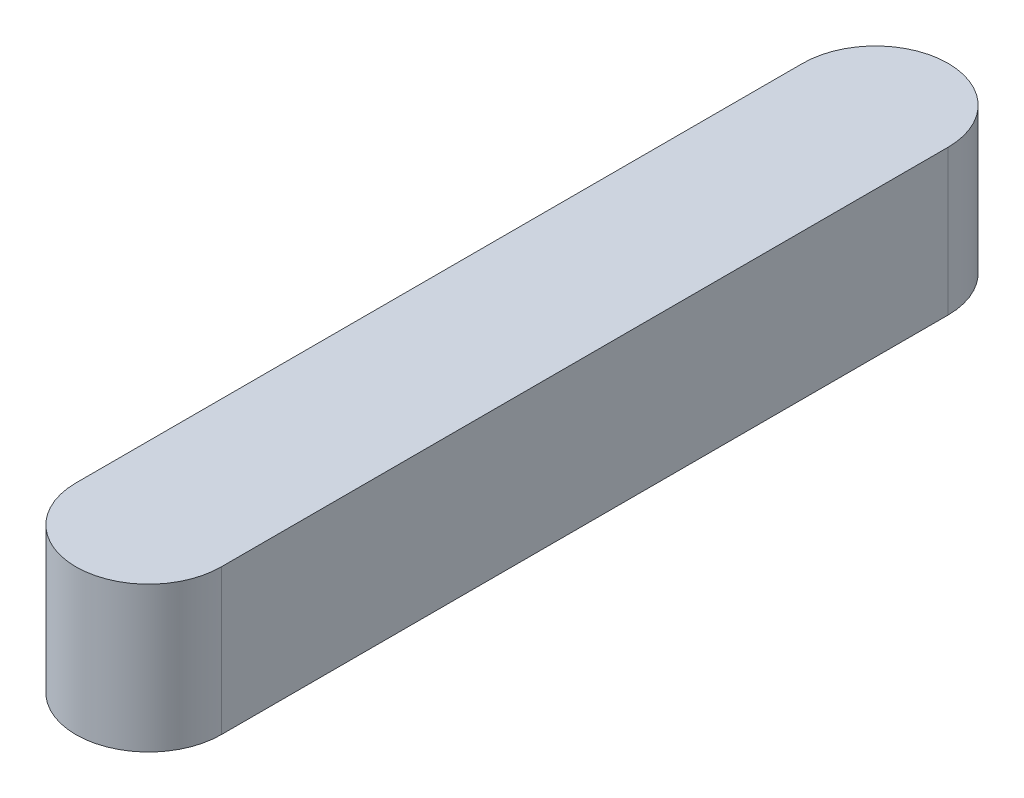
ISO-10303-21;
HEADER;
FILE_DESCRIPTION(('STEP AP214'),'2;1');
FILE_NAME('part.step','',(''),(''),'','','');
FILE_SCHEMA(('AUTOMOTIVE_DESIGN { 1 0 10303 214 1 1 1 1 }'));
ENDSEC;
DATA;
#1=APPLICATION_CONTEXT('core data for automotive mechanical design processes');
#2=APPLICATION_PROTOCOL_DEFINITION('international standard','automotive_design',2000,#1);
#3=PRODUCT_CONTEXT('',#1,'mechanical');
#4=PRODUCT('Part','Part','',(#3));
#5=PRODUCT_RELATED_PRODUCT_CATEGORY('part','',(#4));
#6=PRODUCT_DEFINITION_FORMATION('','',#4);
#7=PRODUCT_DEFINITION_CONTEXT('part definition',#1,'design');
#8=PRODUCT_DEFINITION('design','',#6,#7);
#9=PRODUCT_DEFINITION_SHAPE('','',#8);
#10=(LENGTH_UNIT() NAMED_UNIT(*) SI_UNIT(.MILLI.,.METRE.));
#11=(NAMED_UNIT(*) PLANE_ANGLE_UNIT() SI_UNIT($,.RADIAN.));
#12=(NAMED_UNIT(*) SI_UNIT($,.STERADIAN.) SOLID_ANGLE_UNIT());
#13=UNCERTAINTY_MEASURE_WITH_UNIT(LENGTH_MEASURE(1.E-05),#10,'distance_accuracy_value','');
#14=(GEOMETRIC_REPRESENTATION_CONTEXT(3) GLOBAL_UNCERTAINTY_ASSIGNED_CONTEXT((#13)) GLOBAL_UNIT_ASSIGNED_CONTEXT((#10,
#11,#12)) REPRESENTATION_CONTEXT('',''));
#15=CARTESIAN_POINT('',(0.,0.,0.));
#16=DIRECTION('',(0.,0.,1.));
#17=DIRECTION('',(1.,0.,0.));
#18=AXIS2_PLACEMENT_3D('',#15,#16,#17);
#19=CARTESIAN_POINT('',(182.4677415,-231.1089499,679.9014018));
#20=CARTESIAN_POINT('',(182.4677415,-226.1089499,679.9014018));
#21=(BOUNDED_CURVE() B_SPLINE_CURVE(1,(#19,#20),.UNSPECIFIED.,.F.,
.F.) B_SPLINE_CURVE_WITH_KNOTS((2,2),(0.,1.),
.UNSPECIFIED.) CURVE() GEOMETRIC_REPRESENTATION_ITEM() RATIONAL_B_SPLINE_CURVE((1.,1.)) REPRESENTATION_ITEM(''));
#22=CARTESIAN_POINT('',(179.9677415,-228.6089499,679.9014018));
#23=DIRECTION('',(0.,1.,0.));
#24=AXIS1_PLACEMENT('',#22,#23);
#25=SURFACE_OF_REVOLUTION('',#21,#24);
#26=CARTESIAN_POINT('',(177.4677415,-231.1089499,679.9014018));
#27=CARTESIAN_POINT('',(177.4677415,-230.900616566667,679.9014018));
#28=CARTESIAN_POINT('',(177.4677415,-230.692283233333,679.9014018));
#29=CARTESIAN_POINT('',(177.4677415,-230.275616566667,679.9014018));
#30=CARTESIAN_POINT('',(177.4677415,-230.067283233333,679.9014018));
#31=CARTESIAN_POINT('',(177.4677415,-229.650616566667,679.9014018));
#32=CARTESIAN_POINT('',(177.4677415,-229.442283233333,679.9014018));
#33=CARTESIAN_POINT('',(177.4677415,-229.025616566667,679.9014018));
#34=CARTESIAN_POINT('',(177.4677415,-228.817283233333,679.9014018));
#35=CARTESIAN_POINT('',(177.4677415,-228.400616566667,679.9014018));
#36=CARTESIAN_POINT('',(177.4677415,-228.192283233333,679.9014018));
#37=CARTESIAN_POINT('',(177.4677415,-227.775616566667,679.9014018));
#38=CARTESIAN_POINT('',(177.4677415,-227.567283233333,679.9014018));
#39=CARTESIAN_POINT('',(177.4677415,-227.150616566667,679.9014018));
#40=CARTESIAN_POINT('',(177.4677415,-226.942283233333,679.9014018));
#41=CARTESIAN_POINT('',(177.4677415,-226.525616566667,679.9014018));
#42=CARTESIAN_POINT('',(177.4677415,-226.317283233333,679.9014018));
#43=CARTESIAN_POINT('',(177.4677415,-226.1089499,679.9014018));
#44=B_SPLINE_CURVE_WITH_KNOTS('',3,(#26,#27,#28,#29,#30,#31,#32,#33,#34,#35,#36,#37,#38,#39,#40,
#41,#42,#43),.UNSPECIFIED.,.F.,.F.,(4,2,2,2,2,2,2,2,4),(0.,0.625000000000014,1.25,
1.87499999999999,2.5,3.12499999999999,3.75,4.37499999999999,5.),.UNSPECIFIED.);
#45=CARTESIAN_POINT('',(177.4677415,-231.1089499,679.9014018));
#46=VERTEX_POINT('',#45);
#47=CARTESIAN_POINT('',(177.4677415,-226.1089499,679.9014018));
#48=VERTEX_POINT('',#47);
#49=EDGE_CURVE('E55',#46,#48,#44,.T.);
#50=ORIENTED_EDGE('',*,*,#49,.T.);
#51=CARTESIAN_POINT('',(179.9677415,-226.1089499,679.9014018));
#52=DIRECTION('',(0.,-1.,0.));
#53=DIRECTION('',(-1.,0.,0.));
#54=AXIS2_PLACEMENT_3D('',#51,#52,#53);
#55=CIRCLE('',#54,2.5);
#56=CARTESIAN_POINT('',(182.4677415,-226.1089499,679.9014018));
#57=VERTEX_POINT('',#56);
#58=EDGE_CURVE('E58',#48,#57,#55,.T.);
#59=ORIENTED_EDGE('',*,*,#58,.T.);
#60=CARTESIAN_POINT('',(182.4677415,-226.1089499,679.9014018));
#61=CARTESIAN_POINT('',(182.4677415,-226.317283233333,679.9014018));
#62=CARTESIAN_POINT('',(182.4677415,-226.525616566667,679.9014018));
#63=CARTESIAN_POINT('',(182.4677415,-226.942283233333,679.9014018));
#64=CARTESIAN_POINT('',(182.4677415,-227.150616566667,679.9014018));
#65=CARTESIAN_POINT('',(182.4677415,-227.567283233333,679.9014018));
#66=CARTESIAN_POINT('',(182.4677415,-227.775616566667,679.9014018));
#67=CARTESIAN_POINT('',(182.4677415,-228.192283233333,679.9014018));
#68=CARTESIAN_POINT('',(182.4677415,-228.400616566667,679.9014018));
#69=CARTESIAN_POINT('',(182.4677415,-228.817283233333,679.9014018));
#70=CARTESIAN_POINT('',(182.4677415,-229.025616566667,679.9014018));
#71=CARTESIAN_POINT('',(182.4677415,-229.442283233333,679.9014018));
#72=CARTESIAN_POINT('',(182.4677415,-229.650616566667,679.9014018));
#73=CARTESIAN_POINT('',(182.4677415,-230.067283233333,679.9014018));
#74=CARTESIAN_POINT('',(182.4677415,-230.275616566667,679.9014018));
#75=CARTESIAN_POINT('',(182.4677415,-230.692283233333,679.9014018));
#76=CARTESIAN_POINT('',(182.4677415,-230.900616566667,679.9014018));
#77=CARTESIAN_POINT('',(182.4677415,-231.1089499,679.9014018));
#78=B_SPLINE_CURVE_WITH_KNOTS('',3,(#60,#61,#62,#63,#64,#65,#66,#67,#68,#69,#70,#71,#72,#73,#74,
#75,#76,#77),.UNSPECIFIED.,.F.,.F.,(4,2,2,2,2,2,2,2,4),(0.,0.625000000000014,1.25,
1.87500000000002,2.5,3.12500000000002,3.75,4.37499999999999,5.),.UNSPECIFIED.);
#79=CARTESIAN_POINT('',(182.4677415,-231.1089499,679.9014018));
#80=VERTEX_POINT('',#79);
#81=EDGE_CURVE('E135',#57,#80,#78,.T.);
#82=ORIENTED_EDGE('',*,*,#81,.T.);
#83=CARTESIAN_POINT('',(179.9677415,-231.1089499,679.9014018));
#84=DIRECTION('',(0.,1.,0.));
#85=DIRECTION('',(1.,0.,0.));
#86=AXIS2_PLACEMENT_3D('',#83,#84,#85);
#87=CIRCLE('',#86,2.5);
#88=EDGE_CURVE('E61',#80,#46,#87,.T.);
#89=ORIENTED_EDGE('',*,*,#88,.T.);
#90=EDGE_LOOP('',(#50,#59,#82,#89));
#91=FACE_BOUND('',#90,.T.);
#92=ADVANCED_FACE('F14',(#91),#25,.T.);
#93=CARTESIAN_POINT('',(177.4677415,0.,0.));
#94=DIRECTION('',(-1.,0.,0.));
#95=DIRECTION('',(0.,0.,1.));
#96=AXIS2_PLACEMENT_3D('',#93,#94,#95);
#97=PLANE('',#96);
#98=CARTESIAN_POINT('',(177.4677415,-226.1089499,704.9014018));
#99=CARTESIAN_POINT('',(177.4677415,-226.317283233333,704.9014018));
#100=CARTESIAN_POINT('',(177.4677415,-226.525616566667,704.9014018));
#101=CARTESIAN_POINT('',(177.4677415,-226.942283233333,704.9014018));
#102=CARTESIAN_POINT('',(177.4677415,-227.150616566667,704.9014018));
#103=CARTESIAN_POINT('',(177.4677415,-227.567283233333,704.9014018));
#104=CARTESIAN_POINT('',(177.4677415,-227.775616566667,704.9014018));
#105=CARTESIAN_POINT('',(177.4677415,-228.192283233333,704.9014018));
#106=CARTESIAN_POINT('',(177.4677415,-228.400616566667,704.9014018));
#107=CARTESIAN_POINT('',(177.4677415,-228.817283233333,704.9014018));
#108=CARTESIAN_POINT('',(177.4677415,-229.025616566667,704.9014018));
#109=CARTESIAN_POINT('',(177.4677415,-229.442283233333,704.9014018));
#110=CARTESIAN_POINT('',(177.4677415,-229.650616566667,704.9014018));
#111=CARTESIAN_POINT('',(177.4677415,-230.067283233333,704.9014018));
#112=CARTESIAN_POINT('',(177.4677415,-230.275616566667,704.9014018));
#113=CARTESIAN_POINT('',(177.4677415,-230.692283233333,704.9014018));
#114=CARTESIAN_POINT('',(177.4677415,-230.900616566667,704.9014018));
#115=CARTESIAN_POINT('',(177.4677415,-231.1089499,704.9014018));
#116=B_SPLINE_CURVE_WITH_KNOTS('',3,(#98,#99,#100,#101,#102,#103,#104,#105,#106,#107,#108,#109,
#110,#111,#112,#113,#114,#115),.UNSPECIFIED.,.F.,.F.,(4,2,2,2,2,2,2,2,4),(0.,0.625000000000014,
1.25,1.87500000000002,2.5,3.12500000000002,3.75,4.37499999999999,5.),.UNSPECIFIED.);
#117=CARTESIAN_POINT('',(177.4677415,-231.1089499,704.9014018));
#118=VERTEX_POINT('',#117);
#119=CARTESIAN_POINT('',(177.4677415,-226.1089499,704.9014018));
#120=VERTEX_POINT('',#119);
#121=EDGE_CURVE('E87',#118,#120,#116,.F.);
#122=ORIENTED_EDGE('',*,*,#121,.T.);
#123=CARTESIAN_POINT('',(177.4677415,-226.1089499,704.9014018));
#124=DIRECTION('',(0.,0.,-1.));
#125=VECTOR('',#124,1.);
#126=LINE('',#123,#125);
#127=EDGE_CURVE('E68',#120,#48,#126,.T.);
#128=ORIENTED_EDGE('',*,*,#127,.T.);
#129=ORIENTED_EDGE('',*,*,#49,.F.);
#130=CARTESIAN_POINT('',(177.4677415,-231.1089499,679.9014018));
#131=DIRECTION('',(0.,0.,1.));
#132=VECTOR('',#131,1.);
#133=LINE('',#130,#132);
#134=EDGE_CURVE('E119',#46,#118,#133,.T.);
#135=ORIENTED_EDGE('',*,*,#134,.T.);
#136=EDGE_LOOP('',(#122,#128,#129,#135));
#137=FACE_BOUND('',#136,.T.);
#138=ADVANCED_FACE('F85',(#137),#97,.T.);
#139=CARTESIAN_POINT('',(0.,-226.1089499,0.));
#140=DIRECTION('',(0.,1.,0.));
#141=DIRECTION('',(0.,0.,1.));
#142=AXIS2_PLACEMENT_3D('',#139,#140,#141);
#143=PLANE('',#142);
#144=CARTESIAN_POINT('',(182.4677415,-226.1089499,704.9014018));
#145=DIRECTION('',(0.,0.,-1.));
#146=VECTOR('',#145,1.);
#147=LINE('',#144,#146);
#148=CARTESIAN_POINT('',(182.4677415,-226.1089499,704.9014018));
#149=VERTEX_POINT('',#148);
#150=EDGE_CURVE('E78',#149,#57,#147,.T.);
#151=ORIENTED_EDGE('',*,*,#150,.T.);
#152=ORIENTED_EDGE('',*,*,#58,.F.);
#153=ORIENTED_EDGE('',*,*,#127,.F.);
#154=CARTESIAN_POINT('',(179.9677415,-226.1089499,704.9014018));
#155=DIRECTION('',(0.,-1.,0.));
#156=DIRECTION('',(1.,0.,0.));
#157=AXIS2_PLACEMENT_3D('',#154,#155,#156);
#158=CIRCLE('',#157,2.5);
#159=EDGE_CURVE('E200',#120,#149,#158,.F.);
#160=ORIENTED_EDGE('',*,*,#159,.T.);
#161=EDGE_LOOP('',(#151,#152,#153,#160));
#162=FACE_BOUND('',#161,.T.);
#163=ADVANCED_FACE('F74',(#162),#143,.T.);
#164=CARTESIAN_POINT('',(182.4677415,0.,0.));
#165=DIRECTION('',(1.,0.,0.));
#166=DIRECTION('',(0.,0.,-1.));
#167=AXIS2_PLACEMENT_3D('',#164,#165,#166);
#168=PLANE('',#167);
#169=ORIENTED_EDGE('',*,*,#81,.F.);
#170=ORIENTED_EDGE('',*,*,#150,.F.);
#171=CARTESIAN_POINT('',(182.4677415,-231.1089499,704.9014018));
#172=CARTESIAN_POINT('',(182.4677415,-230.900616566667,704.9014018));
#173=CARTESIAN_POINT('',(182.4677415,-230.692283233333,704.9014018));
#174=CARTESIAN_POINT('',(182.4677415,-230.275616566667,704.9014018));
#175=CARTESIAN_POINT('',(182.4677415,-230.067283233333,704.9014018));
#176=CARTESIAN_POINT('',(182.4677415,-229.650616566667,704.9014018));
#177=CARTESIAN_POINT('',(182.4677415,-229.442283233333,704.9014018));
#178=CARTESIAN_POINT('',(182.4677415,-229.025616566667,704.9014018));
#179=CARTESIAN_POINT('',(182.4677415,-228.817283233333,704.9014018));
#180=CARTESIAN_POINT('',(182.4677415,-228.400616566667,704.9014018));
#181=CARTESIAN_POINT('',(182.4677415,-228.192283233333,704.9014018));
#182=CARTESIAN_POINT('',(182.4677415,-227.775616566667,704.9014018));
#183=CARTESIAN_POINT('',(182.4677415,-227.567283233333,704.9014018));
#184=CARTESIAN_POINT('',(182.4677415,-227.150616566667,704.9014018));
#185=CARTESIAN_POINT('',(182.4677415,-226.942283233333,704.9014018));
#186=CARTESIAN_POINT('',(182.4677415,-226.525616566667,704.9014018));
#187=CARTESIAN_POINT('',(182.4677415,-226.317283233333,704.9014018));
#188=CARTESIAN_POINT('',(182.4677415,-226.1089499,704.9014018));
#189=B_SPLINE_CURVE_WITH_KNOTS('',3,(#171,#172,#173,#174,#175,#176,#177,#178,#179,#180,#181,
#182,#183,#184,#185,#186,#187,#188),.UNSPECIFIED.,.F.,.F.,(4,2,2,2,2,2,2,2,4),(0.,
0.625000000000014,1.25,1.87499999999999,2.5,3.12499999999999,3.75,4.37499999999999,5.),.UNSPECIFIED.);
#190=CARTESIAN_POINT('',(182.4677415,-231.1089499,704.9014018));
#191=VERTEX_POINT('',#190);
#192=EDGE_CURVE('E27',#149,#191,#189,.F.);
#193=ORIENTED_EDGE('',*,*,#192,.T.);
#194=CARTESIAN_POINT('',(182.4677415,-231.1089499,704.9014018));
#195=DIRECTION('',(0.,0.,-1.));
#196=VECTOR('',#195,1.);
#197=LINE('',#194,#196);
#198=EDGE_CURVE('E34',#191,#80,#197,.T.);
#199=ORIENTED_EDGE('',*,*,#198,.T.);
#200=EDGE_LOOP('',(#169,#170,#193,#199));
#201=FACE_BOUND('',#200,.T.);
#202=ADVANCED_FACE('F161',(#201),#168,.T.);
#203=CARTESIAN_POINT('',(0.,-231.1089499,0.));
#204=DIRECTION('',(0.,1.,0.));
#205=DIRECTION('',(0.,0.,1.));
#206=AXIS2_PLACEMENT_3D('',#203,#204,#205);
#207=PLANE('',#206);
#208=ORIENTED_EDGE('',*,*,#88,.F.);
#209=ORIENTED_EDGE('',*,*,#198,.F.);
#210=CARTESIAN_POINT('',(179.9677415,-231.1089499,704.9014018));
#211=DIRECTION('',(0.,1.,0.));
#212=DIRECTION('',(-1.,0.,0.));
#213=AXIS2_PLACEMENT_3D('',#210,#211,#212);
#214=CIRCLE('',#213,2.5);
#215=EDGE_CURVE('E9',#191,#118,#214,.F.);
#216=ORIENTED_EDGE('',*,*,#215,.T.);
#217=ORIENTED_EDGE('',*,*,#134,.F.);
#218=EDGE_LOOP('',(#208,#209,#216,#217));
#219=FACE_BOUND('',#218,.T.);
#220=ADVANCED_FACE('F154',(#219),#207,.F.);
#221=CARTESIAN_POINT('',(177.4677415,-231.1089499,704.9014018));
#222=CARTESIAN_POINT('',(177.4677415,-226.1089499,704.9014018));
#223=(BOUNDED_CURVE() B_SPLINE_CURVE(1,(#221,#222),.UNSPECIFIED.,.F.,
.F.) B_SPLINE_CURVE_WITH_KNOTS((2,2),(0.,1.),
.UNSPECIFIED.) CURVE() GEOMETRIC_REPRESENTATION_ITEM() RATIONAL_B_SPLINE_CURVE((1.,1.)) REPRESENTATION_ITEM(''));
#224=CARTESIAN_POINT('',(179.9677415,-228.6089499,704.9014018));
#225=DIRECTION('',(0.,1.,0.));
#226=AXIS1_PLACEMENT('',#224,#225);
#227=SURFACE_OF_REVOLUTION('',#223,#226);
#228=ORIENTED_EDGE('',*,*,#192,.F.);
#229=ORIENTED_EDGE('',*,*,#159,.F.);
#230=ORIENTED_EDGE('',*,*,#121,.F.);
#231=ORIENTED_EDGE('',*,*,#215,.F.);
#232=EDGE_LOOP('',(#228,#229,#230,#231));
#233=FACE_BOUND('',#232,.T.);
#234=ADVANCED_FACE('F199',(#233),#227,.T.);
#235=CLOSED_SHELL('',(#92,#138,#163,#202,#220,#234));
#236=MANIFOLD_SOLID_BREP('B1',#235);
#237=ADVANCED_BREP_SHAPE_REPRESENTATION('',(#18,#236),#14);
#238=SHAPE_DEFINITION_REPRESENTATION(#9,#237);
ENDSEC;
END-ISO-10303-21;
